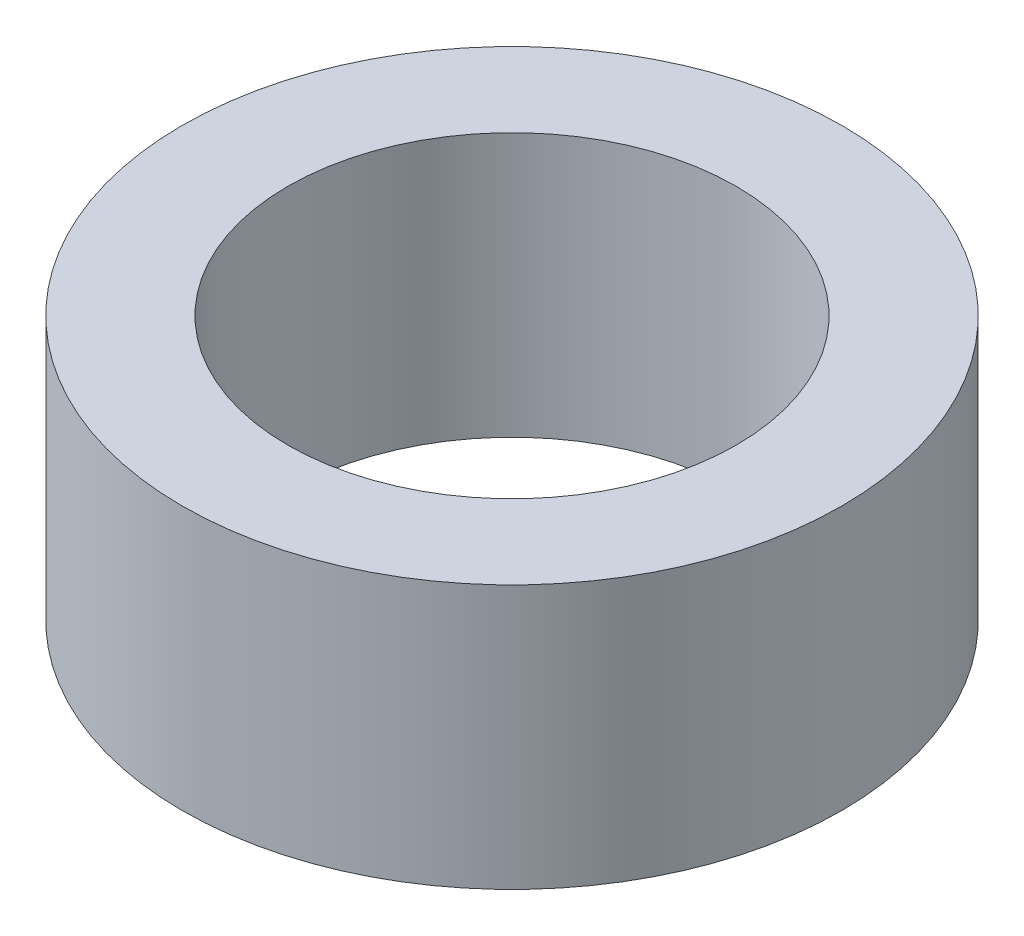
ISO-10303-21;
HEADER;
FILE_DESCRIPTION(('STEP AP214'),'2;1');
FILE_NAME('part.step','',(''),(''),'','','');
FILE_SCHEMA(('AUTOMOTIVE_DESIGN { 1 0 10303 214 1 1 1 1 }'));
ENDSEC;
DATA;
#1=APPLICATION_CONTEXT('core data for automotive mechanical design processes');
#2=APPLICATION_PROTOCOL_DEFINITION('international standard','automotive_design',2000,#1);
#3=PRODUCT_CONTEXT('',#1,'mechanical');
#4=PRODUCT('Part','Part','',(#3));
#5=PRODUCT_RELATED_PRODUCT_CATEGORY('part','',(#4));
#6=PRODUCT_DEFINITION_FORMATION('','',#4);
#7=PRODUCT_DEFINITION_CONTEXT('part definition',#1,'design');
#8=PRODUCT_DEFINITION('design','',#6,#7);
#9=PRODUCT_DEFINITION_SHAPE('','',#8);
#10=(LENGTH_UNIT() NAMED_UNIT(*) SI_UNIT(.MILLI.,.METRE.));
#11=(NAMED_UNIT(*) PLANE_ANGLE_UNIT() SI_UNIT($,.RADIAN.));
#12=(NAMED_UNIT(*) SI_UNIT($,.STERADIAN.) SOLID_ANGLE_UNIT());
#13=UNCERTAINTY_MEASURE_WITH_UNIT(LENGTH_MEASURE(1.E-05),#10,'distance_accuracy_value','');
#14=(GEOMETRIC_REPRESENTATION_CONTEXT(3) GLOBAL_UNCERTAINTY_ASSIGNED_CONTEXT((#13)) GLOBAL_UNIT_ASSIGNED_CONTEXT((#10,
#11,#12)) REPRESENTATION_CONTEXT('',''));
#15=CARTESIAN_POINT('',(0.,0.,0.));
#16=DIRECTION('',(0.,0.,1.));
#17=DIRECTION('',(1.,0.,0.));
#18=AXIS2_PLACEMENT_3D('',#15,#16,#17);
#19=CARTESIAN_POINT('',(0.,2.54,0.));
#20=DIRECTION('',(0.,1.,0.));
#21=DIRECTION('',(0.,0.,1.));
#22=AXIS2_PLACEMENT_3D('',#19,#20,#21);
#23=PLANE('',#22);
#24=CARTESIAN_POINT('',(0.,2.54,0.));
#25=DIRECTION('',(0.,1.,0.));
#26=DIRECTION('',(0.,0.,1.));
#27=AXIS2_PLACEMENT_3D('',#24,#25,#26);
#28=CIRCLE('',#27,3.175);
#29=CARTESIAN_POINT('',(0.,2.54,3.175));
#30=VERTEX_POINT('',#29);
#31=EDGE_CURVE('E10',#30,#30,#28,.T.);
#32=ORIENTED_EDGE('',*,*,#31,.T.);
#33=EDGE_LOOP('',(#32));
#34=FACE_BOUND('',#33,.T.);
#35=CARTESIAN_POINT('',(0.,2.54,0.));
#36=DIRECTION('',(0.,1.,0.));
#37=DIRECTION('',(0.,0.,1.));
#38=AXIS2_PLACEMENT_3D('',#35,#36,#37);
#39=CIRCLE('',#38,2.159);
#40=CARTESIAN_POINT('',(0.,2.54,2.159));
#41=VERTEX_POINT('',#40);
#42=EDGE_CURVE('E48',#41,#41,#39,.T.);
#43=ORIENTED_EDGE('',*,*,#42,.F.);
#44=EDGE_LOOP('',(#43));
#45=FACE_BOUND('',#44,.T.);
#46=ADVANCED_FACE('F37',(#34,#45),#23,.T.);
#47=CARTESIAN_POINT('',(0.,0.,0.));
#48=DIRECTION('',(0.,1.,0.));
#49=DIRECTION('',(0.,0.,1.));
#50=AXIS2_PLACEMENT_3D('',#47,#48,#49);
#51=PLANE('',#50);
#52=CARTESIAN_POINT('',(0.,0.,0.));
#53=DIRECTION('',(0.,1.,0.));
#54=DIRECTION('',(0.,0.,1.));
#55=AXIS2_PLACEMENT_3D('',#52,#53,#54);
#56=CIRCLE('',#55,3.175);
#57=CARTESIAN_POINT('',(0.,0.,3.175));
#58=VERTEX_POINT('',#57);
#59=EDGE_CURVE('E41',#58,#58,#56,.T.);
#60=ORIENTED_EDGE('',*,*,#59,.F.);
#61=EDGE_LOOP('',(#60));
#62=FACE_BOUND('',#61,.T.);
#63=CARTESIAN_POINT('',(0.,0.,0.));
#64=DIRECTION('',(0.,1.,0.));
#65=DIRECTION('',(0.,0.,1.));
#66=AXIS2_PLACEMENT_3D('',#63,#64,#65);
#67=CIRCLE('',#66,2.159);
#68=CARTESIAN_POINT('',(0.,0.,2.159));
#69=VERTEX_POINT('',#68);
#70=EDGE_CURVE('E50',#69,#69,#67,.T.);
#71=ORIENTED_EDGE('',*,*,#70,.T.);
#72=EDGE_LOOP('',(#71));
#73=FACE_BOUND('',#72,.T.);
#74=ADVANCED_FACE('F60',(#62,#73),#51,.F.);
#75=CARTESIAN_POINT('',(0.,2.54,0.));
#76=DIRECTION('',(0.,-1.,0.));
#77=DIRECTION('',(0.,0.,-1.));
#78=AXIS2_PLACEMENT_3D('',#75,#76,#77);
#79=CYLINDRICAL_SURFACE('',#78,3.175);
#80=ORIENTED_EDGE('',*,*,#31,.F.);
#81=EDGE_LOOP('',(#80));
#82=FACE_BOUND('',#81,.T.);
#83=ORIENTED_EDGE('',*,*,#59,.T.);
#84=EDGE_LOOP('',(#83));
#85=FACE_BOUND('',#84,.T.);
#86=ADVANCED_FACE('F39',(#82,#85),#79,.T.);
#87=CARTESIAN_POINT('',(0.,2.54,0.));
#88=DIRECTION('',(0.,-1.,0.));
#89=DIRECTION('',(0.,0.,-1.));
#90=AXIS2_PLACEMENT_3D('',#87,#88,#89);
#91=CYLINDRICAL_SURFACE('',#90,2.159);
#92=ORIENTED_EDGE('',*,*,#42,.T.);
#93=EDGE_LOOP('',(#92));
#94=FACE_BOUND('',#93,.T.);
#95=ORIENTED_EDGE('',*,*,#70,.F.);
#96=EDGE_LOOP('',(#95));
#97=FACE_BOUND('',#96,.T.);
#98=ADVANCED_FACE('F56',(#94,#97),#91,.F.);
#99=CLOSED_SHELL('',(#46,#74,#86,#98));
#100=MANIFOLD_SOLID_BREP('B2',#99);
#101=ADVANCED_BREP_SHAPE_REPRESENTATION('',(#18,#100),#14);
#102=SHAPE_DEFINITION_REPRESENTATION(#9,#101);
ENDSEC;
END-ISO-10303-21;
